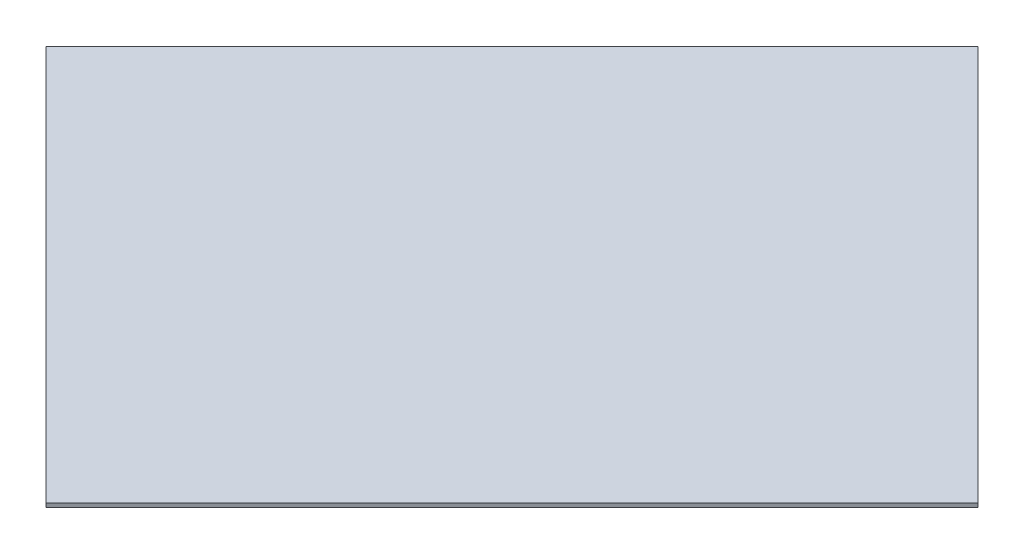
ISO-10303-21;
HEADER;
FILE_DESCRIPTION(('STEP AP214'),'2;1');
FILE_NAME('part.step','',(''),(''),'','','');
FILE_SCHEMA(('AUTOMOTIVE_DESIGN { 1 0 10303 214 1 1 1 1 }'));
ENDSEC;
DATA;
#1=APPLICATION_CONTEXT('core data for automotive mechanical design processes');
#2=APPLICATION_PROTOCOL_DEFINITION('international standard','automotive_design',2000,#1);
#3=PRODUCT_CONTEXT('',#1,'mechanical');
#4=PRODUCT('Part','Part','',(#3));
#5=PRODUCT_RELATED_PRODUCT_CATEGORY('part','',(#4));
#6=PRODUCT_DEFINITION_FORMATION('','',#4);
#7=PRODUCT_DEFINITION_CONTEXT('part definition',#1,'design');
#8=PRODUCT_DEFINITION('design','',#6,#7);
#9=PRODUCT_DEFINITION_SHAPE('','',#8);
#10=(LENGTH_UNIT() NAMED_UNIT(*) SI_UNIT(.MILLI.,.METRE.));
#11=(NAMED_UNIT(*) PLANE_ANGLE_UNIT() SI_UNIT($,.RADIAN.));
#12=(NAMED_UNIT(*) SI_UNIT($,.STERADIAN.) SOLID_ANGLE_UNIT());
#13=UNCERTAINTY_MEASURE_WITH_UNIT(LENGTH_MEASURE(1.E-05),#10,'distance_accuracy_value','');
#14=(GEOMETRIC_REPRESENTATION_CONTEXT(3) GLOBAL_UNCERTAINTY_ASSIGNED_CONTEXT((#13)) GLOBAL_UNIT_ASSIGNED_CONTEXT((#10,
#11,#12)) REPRESENTATION_CONTEXT('',''));
#15=CARTESIAN_POINT('',(0.,0.,0.));
#16=DIRECTION('',(0.,0.,1.));
#17=DIRECTION('',(1.,0.,0.));
#18=AXIS2_PLACEMENT_3D('',#15,#16,#17);
#19=CARTESIAN_POINT('',(-25.,10.,25.));
#20=DIRECTION('',(-0.707106781186548,0.,0.707106781186547));
#21=DIRECTION('',(0.707106781186547,0.,0.707106781186548));
#22=AXIS2_PLACEMENT_3D('',#19,#20,#21);
#23=PLANE('',#22);
#24=DIRECTION('',(0.,1.,0.));
#25=VECTOR('',#24,1.);
#26=CARTESIAN_POINT('',(-71.2132034355964,10.,-21.2132034355964));
#27=LINE('',#26,#25);
#28=CARTESIAN_POINT('',(-71.2132034355964,10.,-21.2132034355964));
#29=VERTEX_POINT('',#28);
#30=CARTESIAN_POINT('',(-71.2132034355964,10.2,-21.2132034355964));
#31=VERTEX_POINT('',#30);
#32=EDGE_CURVE('E11',#29,#31,#27,.T.);
#33=ORIENTED_EDGE('',*,*,#32,.F.);
#34=DIRECTION('',(0.707106781186547,0.,0.707106781186548));
#35=VECTOR('',#34,1.);
#36=CARTESIAN_POINT('',(-25.,10.,25.));
#37=LINE('',#36,#35);
#38=CARTESIAN_POINT('',(-50.,10.,0.));
#39=VERTEX_POINT('',#38);
#40=EDGE_CURVE('E88',#29,#39,#37,.T.);
#41=ORIENTED_EDGE('',*,*,#40,.T.);
#42=DIRECTION('',(0.,1.,0.));
#43=VECTOR('',#42,1.);
#44=CARTESIAN_POINT('',(-50.,10.,0.));
#45=LINE('',#44,#43);
#46=CARTESIAN_POINT('',(-50.,10.2,0.));
#47=VERTEX_POINT('',#46);
#48=EDGE_CURVE('E43',#39,#47,#45,.T.);
#49=ORIENTED_EDGE('',*,*,#48,.T.);
#50=DIRECTION('',(0.707106781186547,0.,0.707106781186548));
#51=VECTOR('',#50,1.);
#52=CARTESIAN_POINT('',(-25.,10.2,25.));
#53=LINE('',#52,#51);
#54=EDGE_CURVE('E101',#31,#47,#53,.T.);
#55=ORIENTED_EDGE('',*,*,#54,.F.);
#56=EDGE_LOOP('',(#33,#41,#49,#55));
#57=FACE_BOUND('',#56,.T.);
#58=ADVANCED_FACE('F33',(#57),#23,.T.);
#59=CARTESIAN_POINT('',(-25.,10.,-25.));
#60=DIRECTION('',(0.707106781186548,0.,0.707106781186548));
#61=DIRECTION('',(0.707106781186548,0.,-0.707106781186548));
#62=AXIS2_PLACEMENT_3D('',#59,#60,#61);
#63=PLANE('',#62);
#64=ORIENTED_EDGE('',*,*,#48,.F.);
#65=DIRECTION('',(0.707106781186548,0.,-0.707106781186548));
#66=VECTOR('',#65,1.);
#67=CARTESIAN_POINT('',(-25.,10.,-25.));
#68=LINE('',#67,#66);
#69=CARTESIAN_POINT('',(-25.,10.,-25.));
#70=VERTEX_POINT('',#69);
#71=EDGE_CURVE('E95',#39,#70,#68,.T.);
#72=ORIENTED_EDGE('',*,*,#71,.T.);
#73=DIRECTION('',(0.,1.,0.));
#74=VECTOR('',#73,1.);
#75=CARTESIAN_POINT('',(-25.,10.,-25.));
#76=LINE('',#75,#74);
#77=CARTESIAN_POINT('',(-25.,10.2,-25.));
#78=VERTEX_POINT('',#77);
#79=EDGE_CURVE('E51',#70,#78,#76,.T.);
#80=ORIENTED_EDGE('',*,*,#79,.T.);
#81=DIRECTION('',(0.707106781186548,0.,-0.707106781186548));
#82=VECTOR('',#81,1.);
#83=CARTESIAN_POINT('',(-25.,10.2,-25.));
#84=LINE('',#83,#82);
#85=EDGE_CURVE('E82',#47,#78,#84,.T.);
#86=ORIENTED_EDGE('',*,*,#85,.F.);
#87=EDGE_LOOP('',(#64,#72,#80,#86));
#88=FACE_BOUND('',#87,.T.);
#89=ADVANCED_FACE('F105',(#88),#63,.T.);
#90=CARTESIAN_POINT('',(-31.4942924536134,10.,-31.4942924536134));
#91=DIRECTION('',(0.707106781186548,0.,-0.707106781186548));
#92=DIRECTION('',(-0.707106781186548,0.,-0.707106781186548));
#93=AXIS2_PLACEMENT_3D('',#90,#91,#92);
#94=PLANE('',#93);
#95=ORIENTED_EDGE('',*,*,#79,.F.);
#96=DIRECTION('',(-0.707106781186548,0.,-0.707106781186548));
#97=VECTOR('',#96,1.);
#98=CARTESIAN_POINT('',(-31.4942924536134,10.,-31.4942924536134));
#99=LINE('',#98,#97);
#100=CARTESIAN_POINT('',(-46.2132034355964,10.,-46.2132034355964));
#101=VERTEX_POINT('',#100);
#102=EDGE_CURVE('E87',#70,#101,#99,.T.);
#103=ORIENTED_EDGE('',*,*,#102,.T.);
#104=DIRECTION('',(0.,1.,0.));
#105=VECTOR('',#104,1.);
#106=CARTESIAN_POINT('',(-46.2132034355964,10.,-46.2132034355964));
#107=LINE('',#106,#105);
#108=CARTESIAN_POINT('',(-46.2132034355964,10.2,-46.2132034355964));
#109=VERTEX_POINT('',#108);
#110=EDGE_CURVE('E37',#101,#109,#107,.T.);
#111=ORIENTED_EDGE('',*,*,#110,.T.);
#112=DIRECTION('',(-0.707106781186548,0.,-0.707106781186548));
#113=VECTOR('',#112,1.);
#114=CARTESIAN_POINT('',(-31.4942924536134,10.2,-31.4942924536134));
#115=LINE('',#114,#113);
#116=EDGE_CURVE('E97',#78,#109,#115,.T.);
#117=ORIENTED_EDGE('',*,*,#116,.F.);
#118=EDGE_LOOP('',(#95,#103,#111,#117));
#119=FACE_BOUND('',#118,.T.);
#120=ADVANCED_FACE('F90',(#119),#94,.T.);
#121=CARTESIAN_POINT('',(-46.2132034355964,10.,-46.2132034355964));
#122=DIRECTION('',(-0.707106781186547,0.,-0.707106781186548));
#123=DIRECTION('',(-0.707106781186548,0.,0.707106781186547));
#124=AXIS2_PLACEMENT_3D('',#121,#122,#123);
#125=PLANE('',#124);
#126=DIRECTION('',(-0.707106781186548,0.,0.707106781186547));
#127=VECTOR('',#126,1.);
#128=CARTESIAN_POINT('',(-46.2132034355964,10.,-46.2132034355964));
#129=LINE('',#128,#127);
#130=EDGE_CURVE('E76',#101,#29,#129,.T.);
#131=ORIENTED_EDGE('',*,*,#130,.T.);
#132=ORIENTED_EDGE('',*,*,#32,.T.);
#133=DIRECTION('',(-0.707106781186548,0.,0.707106781186547));
#134=VECTOR('',#133,1.);
#135=CARTESIAN_POINT('',(-46.2132034355964,10.2,-46.2132034355964));
#136=LINE('',#135,#134);
#137=EDGE_CURVE('E78',#109,#31,#136,.T.);
#138=ORIENTED_EDGE('',*,*,#137,.F.);
#139=ORIENTED_EDGE('',*,*,#110,.F.);
#140=EDGE_LOOP('',(#131,#132,#138,#139));
#141=FACE_BOUND('',#140,.T.);
#142=ADVANCED_FACE('F35',(#141),#125,.T.);
#143=CARTESIAN_POINT('',(0.,10.2,0.));
#144=DIRECTION('',(0.,1.,0.));
#145=DIRECTION('',(0.,0.,1.));
#146=AXIS2_PLACEMENT_3D('',#143,#144,#145);
#147=PLANE('',#146);
#148=ORIENTED_EDGE('',*,*,#116,.T.);
#149=ORIENTED_EDGE('',*,*,#137,.T.);
#150=ORIENTED_EDGE('',*,*,#54,.T.);
#151=ORIENTED_EDGE('',*,*,#85,.T.);
#152=EDGE_LOOP('',(#148,#149,#150,#151));
#153=FACE_BOUND('',#152,.T.);
#154=ADVANCED_FACE('F104',(#153),#147,.T.);
#155=CARTESIAN_POINT('',(0.,10.,0.));
#156=DIRECTION('',(0.,1.,0.));
#157=DIRECTION('',(0.,0.,1.));
#158=AXIS2_PLACEMENT_3D('',#155,#156,#157);
#159=PLANE('',#158);
#160=ORIENTED_EDGE('',*,*,#102,.F.);
#161=ORIENTED_EDGE('',*,*,#71,.F.);
#162=ORIENTED_EDGE('',*,*,#40,.F.);
#163=ORIENTED_EDGE('',*,*,#130,.F.);
#164=EDGE_LOOP('',(#160,#161,#162,#163));
#165=FACE_BOUND('',#164,.T.);
#166=ADVANCED_FACE('F85',(#165),#159,.F.);
#167=CLOSED_SHELL('',(#58,#89,#120,#142,#154,#166));
#168=MANIFOLD_SOLID_BREP('B2',#167);
#169=ADVANCED_BREP_SHAPE_REPRESENTATION('',(#18,#168),#14);
#170=SHAPE_DEFINITION_REPRESENTATION(#9,#169);
ENDSEC;
END-ISO-10303-21;
